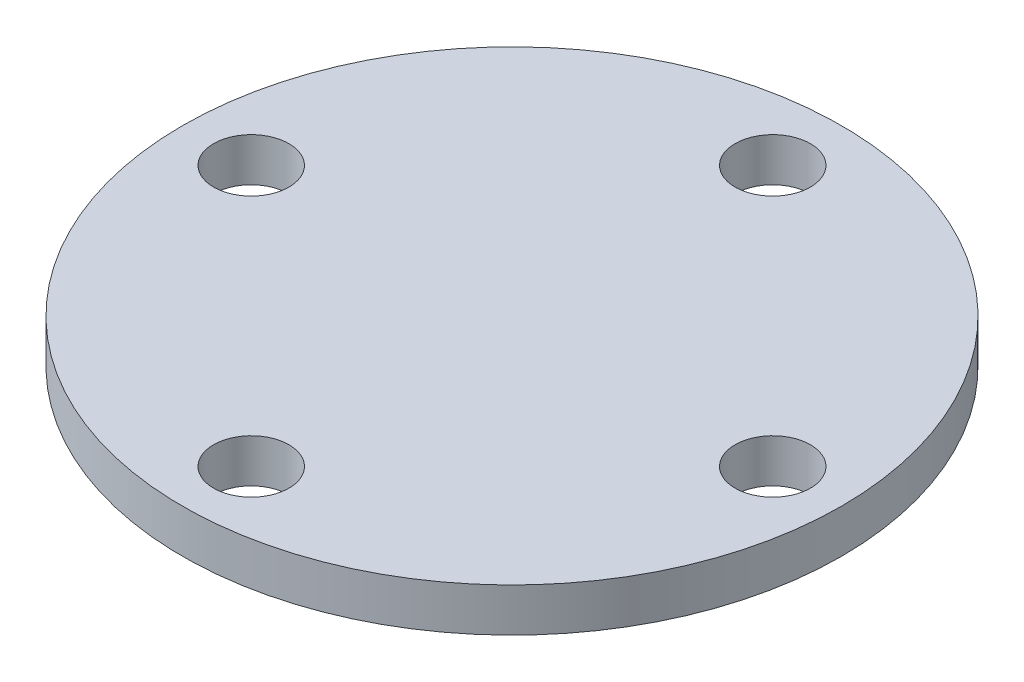
ISO-10303-21;
HEADER;
FILE_DESCRIPTION(('STEP AP214'),'2;1');
FILE_NAME('part.step','',(''),(''),'','','');
FILE_SCHEMA(('AUTOMOTIVE_DESIGN { 1 0 10303 214 1 1 1 1 }'));
ENDSEC;
DATA;
#1=APPLICATION_CONTEXT('core data for automotive mechanical design processes');
#2=APPLICATION_PROTOCOL_DEFINITION('international standard','automotive_design',2000,#1);
#3=PRODUCT_CONTEXT('',#1,'mechanical');
#4=PRODUCT('Part','Part','',(#3));
#5=PRODUCT_RELATED_PRODUCT_CATEGORY('part','',(#4));
#6=PRODUCT_DEFINITION_FORMATION('','',#4);
#7=PRODUCT_DEFINITION_CONTEXT('part definition',#1,'design');
#8=PRODUCT_DEFINITION('design','',#6,#7);
#9=PRODUCT_DEFINITION_SHAPE('','',#8);
#10=(LENGTH_UNIT() NAMED_UNIT(*) SI_UNIT(.MILLI.,.METRE.));
#11=(NAMED_UNIT(*) PLANE_ANGLE_UNIT() SI_UNIT($,.RADIAN.));
#12=(NAMED_UNIT(*) SI_UNIT($,.STERADIAN.) SOLID_ANGLE_UNIT());
#13=UNCERTAINTY_MEASURE_WITH_UNIT(LENGTH_MEASURE(1.E-05),#10,'distance_accuracy_value','');
#14=(GEOMETRIC_REPRESENTATION_CONTEXT(3) GLOBAL_UNCERTAINTY_ASSIGNED_CONTEXT((#13)) GLOBAL_UNIT_ASSIGNED_CONTEXT((#10,
#11,#12)) REPRESENTATION_CONTEXT('',''));
#15=CARTESIAN_POINT('',(0.,0.,0.));
#16=DIRECTION('',(0.,0.,1.));
#17=DIRECTION('',(1.,0.,0.));
#18=AXIS2_PLACEMENT_3D('',#15,#16,#17);
#19=CARTESIAN_POINT('',(0.,3.,-18.));
#20=DIRECTION('',(0.,-1.,0.));
#21=DIRECTION('',(1.,0.,0.));
#22=AXIS2_PLACEMENT_3D('',#19,#20,#21);
#23=CYLINDRICAL_SURFACE('',#22,2.6);
#24=CARTESIAN_POINT('',(0.,3.,-18.));
#25=DIRECTION('',(0.,-1.,0.));
#26=DIRECTION('',(1.,0.,0.));
#27=AXIS2_PLACEMENT_3D('',#24,#25,#26);
#28=CIRCLE('',#27,2.6);
#29=CARTESIAN_POINT('',(-2.6,3.,-18.));
#30=VERTEX_POINT('',#29);
#31=EDGE_CURVE('E99',#30,#30,#28,.T.);
#32=ORIENTED_EDGE('',*,*,#31,.F.);
#33=DIRECTION('',(0.,-1.,0.));
#34=VECTOR('',#33,1.);
#35=CARTESIAN_POINT('',(-2.6,3.,-18.));
#36=LINE('',#35,#34);
#37=CARTESIAN_POINT('',(-2.6,0.,-18.));
#38=VERTEX_POINT('',#37);
#39=EDGE_CURVE('E11',#30,#38,#36,.T.);
#40=ORIENTED_EDGE('',*,*,#39,.T.);
#41=CARTESIAN_POINT('',(0.,0.,-18.));
#42=DIRECTION('',(0.,-1.,0.));
#43=DIRECTION('',(1.,0.,0.));
#44=AXIS2_PLACEMENT_3D('',#41,#42,#43);
#45=CIRCLE('',#44,2.6);
#46=EDGE_CURVE('E88',#38,#38,#45,.T.);
#47=ORIENTED_EDGE('',*,*,#46,.T.);
#48=ORIENTED_EDGE('',*,*,#39,.F.);
#49=EDGE_LOOP('',(#32,#40,#47,#48));
#50=FACE_BOUND('',#49,.T.);
#51=ADVANCED_FACE('F17',(#50),#23,.F.);
#52=CARTESIAN_POINT('',(-18.,3.,0.));
#53=DIRECTION('',(0.,-1.,0.));
#54=DIRECTION('',(1.,0.,0.));
#55=AXIS2_PLACEMENT_3D('',#52,#53,#54);
#56=CYLINDRICAL_SURFACE('',#55,2.6);
#57=CARTESIAN_POINT('',(-18.,3.,0.));
#58=DIRECTION('',(0.,-1.,0.));
#59=DIRECTION('',(1.,0.,0.));
#60=AXIS2_PLACEMENT_3D('',#57,#58,#59);
#61=CIRCLE('',#60,2.6);
#62=CARTESIAN_POINT('',(-20.6,3.,0.));
#63=VERTEX_POINT('',#62);
#64=EDGE_CURVE('E102',#63,#63,#61,.T.);
#65=ORIENTED_EDGE('',*,*,#64,.F.);
#66=DIRECTION('',(0.,-1.,0.));
#67=VECTOR('',#66,1.);
#68=CARTESIAN_POINT('',(-20.6,3.,0.));
#69=LINE('',#68,#67);
#70=CARTESIAN_POINT('',(-20.6,0.,0.));
#71=VERTEX_POINT('',#70);
#72=EDGE_CURVE('E28',#63,#71,#69,.T.);
#73=ORIENTED_EDGE('',*,*,#72,.T.);
#74=CARTESIAN_POINT('',(-18.,0.,0.));
#75=DIRECTION('',(0.,-1.,0.));
#76=DIRECTION('',(1.,0.,0.));
#77=AXIS2_PLACEMENT_3D('',#74,#75,#76);
#78=CIRCLE('',#77,2.6);
#79=EDGE_CURVE('E92',#71,#71,#78,.T.);
#80=ORIENTED_EDGE('',*,*,#79,.T.);
#81=ORIENTED_EDGE('',*,*,#72,.F.);
#82=EDGE_LOOP('',(#65,#73,#80,#81));
#83=FACE_BOUND('',#82,.T.);
#84=ADVANCED_FACE('F129',(#83),#56,.F.);
#85=CARTESIAN_POINT('',(0.,3.,18.));
#86=DIRECTION('',(0.,-1.,0.));
#87=DIRECTION('',(1.,0.,0.));
#88=AXIS2_PLACEMENT_3D('',#85,#86,#87);
#89=CYLINDRICAL_SURFACE('',#88,2.6);
#90=CARTESIAN_POINT('',(0.,3.,18.));
#91=DIRECTION('',(0.,-1.,0.));
#92=DIRECTION('',(1.,0.,0.));
#93=AXIS2_PLACEMENT_3D('',#90,#91,#92);
#94=CIRCLE('',#93,2.6);
#95=CARTESIAN_POINT('',(-2.6,3.,18.));
#96=VERTEX_POINT('',#95);
#97=EDGE_CURVE('E87',#96,#96,#94,.T.);
#98=ORIENTED_EDGE('',*,*,#97,.F.);
#99=DIRECTION('',(0.,-1.,0.));
#100=VECTOR('',#99,1.);
#101=CARTESIAN_POINT('',(-2.6,3.,18.));
#102=LINE('',#101,#100);
#103=CARTESIAN_POINT('',(-2.6,0.,18.));
#104=VERTEX_POINT('',#103);
#105=EDGE_CURVE('E105',#96,#104,#102,.T.);
#106=ORIENTED_EDGE('',*,*,#105,.T.);
#107=CARTESIAN_POINT('',(0.,0.,18.));
#108=DIRECTION('',(0.,-1.,0.));
#109=DIRECTION('',(1.,0.,0.));
#110=AXIS2_PLACEMENT_3D('',#107,#108,#109);
#111=CIRCLE('',#110,2.6);
#112=EDGE_CURVE('E96',#104,#104,#111,.T.);
#113=ORIENTED_EDGE('',*,*,#112,.T.);
#114=ORIENTED_EDGE('',*,*,#105,.F.);
#115=EDGE_LOOP('',(#98,#106,#113,#114));
#116=FACE_BOUND('',#115,.T.);
#117=ADVANCED_FACE('F186',(#116),#89,.F.);
#118=CARTESIAN_POINT('',(18.,3.,0.));
#119=DIRECTION('',(0.,-1.,0.));
#120=DIRECTION('',(1.,0.,0.));
#121=AXIS2_PLACEMENT_3D('',#118,#119,#120);
#122=CYLINDRICAL_SURFACE('',#121,2.6);
#123=CARTESIAN_POINT('',(18.,3.,0.));
#124=DIRECTION('',(0.,-1.,0.));
#125=DIRECTION('',(1.,0.,0.));
#126=AXIS2_PLACEMENT_3D('',#123,#124,#125);
#127=CIRCLE('',#126,2.6);
#128=CARTESIAN_POINT('',(15.4,3.,0.));
#129=VERTEX_POINT('',#128);
#130=EDGE_CURVE('E79',#129,#129,#127,.T.);
#131=ORIENTED_EDGE('',*,*,#130,.F.);
#132=DIRECTION('',(0.,-1.,0.));
#133=VECTOR('',#132,1.);
#134=CARTESIAN_POINT('',(15.4,3.,0.));
#135=LINE('',#134,#133);
#136=CARTESIAN_POINT('',(15.4,0.,0.));
#137=VERTEX_POINT('',#136);
#138=EDGE_CURVE('E101',#129,#137,#135,.T.);
#139=ORIENTED_EDGE('',*,*,#138,.T.);
#140=CARTESIAN_POINT('',(18.,0.,0.));
#141=DIRECTION('',(0.,-1.,0.));
#142=DIRECTION('',(1.,0.,0.));
#143=AXIS2_PLACEMENT_3D('',#140,#141,#142);
#144=CIRCLE('',#143,2.6);
#145=EDGE_CURVE('E107',#137,#137,#144,.T.);
#146=ORIENTED_EDGE('',*,*,#145,.T.);
#147=ORIENTED_EDGE('',*,*,#138,.F.);
#148=EDGE_LOOP('',(#131,#139,#146,#147));
#149=FACE_BOUND('',#148,.T.);
#150=ADVANCED_FACE('F181',(#149),#122,.F.);
#151=CARTESIAN_POINT('',(0.,3.,0.));
#152=DIRECTION('',(0.,-1.,0.));
#153=DIRECTION('',(0.,0.,-1.));
#154=AXIS2_PLACEMENT_3D('',#151,#152,#153);
#155=PLANE('',#154);
#156=ORIENTED_EDGE('',*,*,#31,.T.);
#157=EDGE_LOOP('',(#156));
#158=FACE_BOUND('',#157,.T.);
#159=ORIENTED_EDGE('',*,*,#64,.T.);
#160=EDGE_LOOP('',(#159));
#161=FACE_BOUND('',#160,.T.);
#162=ORIENTED_EDGE('',*,*,#97,.T.);
#163=EDGE_LOOP('',(#162));
#164=FACE_BOUND('',#163,.T.);
#165=ORIENTED_EDGE('',*,*,#130,.T.);
#166=EDGE_LOOP('',(#165));
#167=FACE_BOUND('',#166,.T.);
#168=CARTESIAN_POINT('',(0.,3.,0.));
#169=DIRECTION('',(0.,-1.,0.));
#170=DIRECTION('',(1.,0.,0.));
#171=AXIS2_PLACEMENT_3D('',#168,#169,#170);
#172=CIRCLE('',#171,22.75);
#173=CARTESIAN_POINT('',(22.75,3.,0.));
#174=VERTEX_POINT('',#173);
#175=EDGE_CURVE('E72',#174,#174,#172,.T.);
#176=ORIENTED_EDGE('',*,*,#175,.F.);
#177=EDGE_LOOP('',(#176));
#178=FACE_BOUND('',#177,.T.);
#179=ADVANCED_FACE('F126',(#158,#161,#164,#167,#178),#155,.F.);
#180=CARTESIAN_POINT('',(0.,3.15,0.));
#181=DIRECTION('',(0.,-1.,0.));
#182=DIRECTION('',(-1.,0.,0.));
#183=AXIS2_PLACEMENT_3D('',#180,#181,#182);
#184=CYLINDRICAL_SURFACE('',#183,22.75);
#185=CARTESIAN_POINT('',(0.,0.,0.));
#186=DIRECTION('',(0.,-1.,0.));
#187=DIRECTION('',(1.,0.,0.));
#188=AXIS2_PLACEMENT_3D('',#185,#186,#187);
#189=CIRCLE('',#188,22.75);
#190=CARTESIAN_POINT('',(22.75,0.,0.));
#191=VERTEX_POINT('',#190);
#192=EDGE_CURVE('E21',#191,#191,#189,.T.);
#193=ORIENTED_EDGE('',*,*,#192,.F.);
#194=DIRECTION('',(0.,1.,0.));
#195=VECTOR('',#194,1.);
#196=CARTESIAN_POINT('',(22.75,3.15,0.));
#197=LINE('',#196,#195);
#198=EDGE_CURVE('E75',#191,#174,#197,.T.);
#199=ORIENTED_EDGE('',*,*,#198,.T.);
#200=ORIENTED_EDGE('',*,*,#175,.T.);
#201=ORIENTED_EDGE('',*,*,#198,.F.);
#202=EDGE_LOOP('',(#193,#199,#200,#201));
#203=FACE_BOUND('',#202,.T.);
#204=ADVANCED_FACE('F74',(#203),#184,.T.);
#205=CARTESIAN_POINT('',(0.,0.,0.));
#206=DIRECTION('',(0.,-1.,0.));
#207=DIRECTION('',(0.,0.,-1.));
#208=AXIS2_PLACEMENT_3D('',#205,#206,#207);
#209=PLANE('',#208);
#210=ORIENTED_EDGE('',*,*,#46,.F.);
#211=EDGE_LOOP('',(#210));
#212=FACE_BOUND('',#211,.T.);
#213=ORIENTED_EDGE('',*,*,#79,.F.);
#214=EDGE_LOOP('',(#213));
#215=FACE_BOUND('',#214,.T.);
#216=ORIENTED_EDGE('',*,*,#112,.F.);
#217=EDGE_LOOP('',(#216));
#218=FACE_BOUND('',#217,.T.);
#219=ORIENTED_EDGE('',*,*,#145,.F.);
#220=EDGE_LOOP('',(#219));
#221=FACE_BOUND('',#220,.T.);
#222=ORIENTED_EDGE('',*,*,#192,.T.);
#223=EDGE_LOOP('',(#222));
#224=FACE_BOUND('',#223,.T.);
#225=ADVANCED_FACE('F19',(#212,#215,#218,#221,#224),#209,.T.);
#226=CLOSED_SHELL('',(#51,#84,#117,#150,#179,#204,#225));
#227=MANIFOLD_SOLID_BREP('B1',#226);
#228=ADVANCED_BREP_SHAPE_REPRESENTATION('',(#18,#227),#14);
#229=SHAPE_DEFINITION_REPRESENTATION(#9,#228);
ENDSEC;
END-ISO-10303-21;
